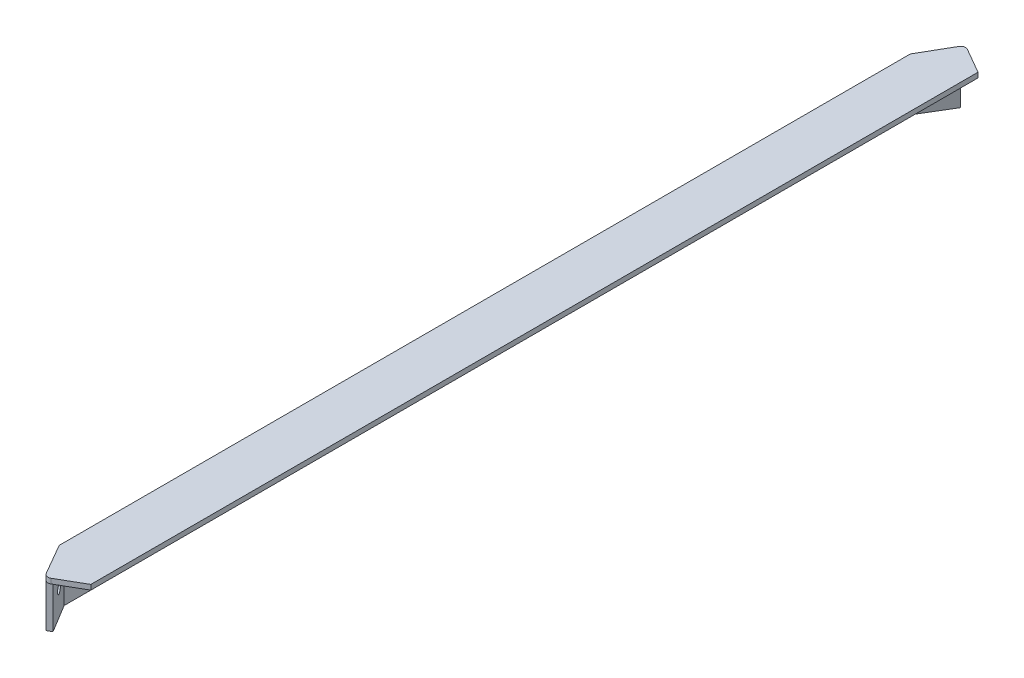
ISO-10303-21;
HEADER;
FILE_DESCRIPTION(('STEP AP214'),'2;1');
FILE_NAME('part.step','',(''),(''),'','','');
FILE_SCHEMA(('AUTOMOTIVE_DESIGN { 1 0 10303 214 1 1 1 1 }'));
ENDSEC;
DATA;
#1=APPLICATION_CONTEXT('core data for automotive mechanical design processes');
#2=APPLICATION_PROTOCOL_DEFINITION('international standard','automotive_design',2000,#1);
#3=PRODUCT_CONTEXT('',#1,'mechanical');
#4=PRODUCT('Part','Part','',(#3));
#5=PRODUCT_RELATED_PRODUCT_CATEGORY('part','',(#4));
#6=PRODUCT_DEFINITION_FORMATION('','',#4);
#7=PRODUCT_DEFINITION_CONTEXT('part definition',#1,'design');
#8=PRODUCT_DEFINITION('design','',#6,#7);
#9=PRODUCT_DEFINITION_SHAPE('','',#8);
#10=(LENGTH_UNIT() NAMED_UNIT(*) SI_UNIT(.MILLI.,.METRE.));
#11=(NAMED_UNIT(*) PLANE_ANGLE_UNIT() SI_UNIT($,.RADIAN.));
#12=(NAMED_UNIT(*) SI_UNIT($,.STERADIAN.) SOLID_ANGLE_UNIT());
#13=UNCERTAINTY_MEASURE_WITH_UNIT(LENGTH_MEASURE(1.E-05),#10,'distance_accuracy_value','');
#14=(GEOMETRIC_REPRESENTATION_CONTEXT(3) GLOBAL_UNCERTAINTY_ASSIGNED_CONTEXT((#13)) GLOBAL_UNIT_ASSIGNED_CONTEXT((#10,
#11,#12)) REPRESENTATION_CONTEXT('',''));
#15=CARTESIAN_POINT('',(0.,0.,0.));
#16=DIRECTION('',(0.,0.,1.));
#17=DIRECTION('',(1.,0.,0.));
#18=AXIS2_PLACEMENT_3D('',#15,#16,#17);
#19=CARTESIAN_POINT('',(7.,0.,600.));
#20=DIRECTION('',(0.,1.,0.));
#21=DIRECTION('',(-1.,0.,0.));
#22=AXIS2_PLACEMENT_3D('',#19,#20,#21);
#23=PLANE('',#22);
#24=DIRECTION('',(0.,0.,-1.));
#25=VECTOR('',#24,1.);
#26=CARTESIAN_POINT('',(0.,0.,600.));
#27=LINE('',#26,#25);
#28=CARTESIAN_POINT('',(0.,0.,600.));
#29=VERTEX_POINT('',#28);
#30=CARTESIAN_POINT('',(0.,0.,-600.));
#31=VERTEX_POINT('',#30);
#32=EDGE_CURVE('E305',#29,#31,#27,.T.);
#33=ORIENTED_EDGE('',*,*,#32,.T.);
#34=DIRECTION('',(0.499999999999995,0.,-0.866025403784441));
#35=VECTOR('',#34,1.);
#36=CARTESIAN_POINT('',(0.,0.,-600.));
#37=LINE('',#36,#35);
#38=CARTESIAN_POINT('',(24.9999999999997,0.,-643.301270189222));
#39=VERTEX_POINT('',#38);
#40=EDGE_CURVE('E165',#31,#39,#37,.T.);
#41=ORIENTED_EDGE('',*,*,#40,.T.);
#42=DIRECTION('',(0.86602540378444,0.,0.499999999999997));
#43=VECTOR('',#42,1.);
#44=CARTESIAN_POINT('',(24.9999999999997,0.,-643.301270189222));
#45=LINE('',#44,#43);
#46=CARTESIAN_POINT('',(31.0621778264906,0.,-639.801270189222));
#47=VERTEX_POINT('',#46);
#48=EDGE_CURVE('E209',#39,#47,#45,.T.);
#49=ORIENTED_EDGE('',*,*,#48,.T.);
#50=DIRECTION('',(-0.517360980401763,0.,0.855767267402608));
#51=VECTOR('',#50,1.);
#52=CARTESIAN_POINT('',(31.0621778264906,0.,-639.801270189222));
#53=LINE('',#52,#51);
#54=CARTESIAN_POINT('',(7.,0.,-600.));
#55=VERTEX_POINT('',#54);
#56=EDGE_CURVE('E205',#47,#55,#53,.T.);
#57=ORIENTED_EDGE('',*,*,#56,.T.);
#58=DIRECTION('',(0.,0.,-1.));
#59=VECTOR('',#58,1.);
#60=CARTESIAN_POINT('',(7.,0.,600.));
#61=LINE('',#60,#59);
#62=CARTESIAN_POINT('',(7.,0.,600.));
#63=VERTEX_POINT('',#62);
#64=EDGE_CURVE('E317',#63,#55,#61,.T.);
#65=ORIENTED_EDGE('',*,*,#64,.F.);
#66=DIRECTION('',(-0.517360980401763,0.,-0.855767267402608));
#67=VECTOR('',#66,1.);
#68=CARTESIAN_POINT('',(31.0621778264906,0.,639.801270189222));
#69=LINE('',#68,#67);
#70=CARTESIAN_POINT('',(31.0621778264906,0.,639.801270189222));
#71=VERTEX_POINT('',#70);
#72=EDGE_CURVE('E283',#71,#63,#69,.T.);
#73=ORIENTED_EDGE('',*,*,#72,.F.);
#74=DIRECTION('',(0.86602540378444,0.,-0.499999999999997));
#75=VECTOR('',#74,1.);
#76=CARTESIAN_POINT('',(24.9999999999997,0.,643.301270189222));
#77=LINE('',#76,#75);
#78=CARTESIAN_POINT('',(24.9999999999997,0.,643.301270189222));
#79=VERTEX_POINT('',#78);
#80=EDGE_CURVE('E286',#79,#71,#77,.T.);
#81=ORIENTED_EDGE('',*,*,#80,.F.);
#82=DIRECTION('',(0.499999999999995,0.,0.866025403784441));
#83=VECTOR('',#82,1.);
#84=CARTESIAN_POINT('',(0.,0.,600.));
#85=LINE('',#84,#83);
#86=EDGE_CURVE('E278',#29,#79,#85,.T.);
#87=ORIENTED_EDGE('',*,*,#86,.F.);
#88=EDGE_LOOP('',(#33,#41,#49,#57,#65,#73,#81,#87));
#89=FACE_BOUND('',#88,.T.);
#90=ADVANCED_FACE('F45',(#89),#23,.F.);
#91=CARTESIAN_POINT('',(6.99999999999999,63.,600.));
#92=DIRECTION('',(-1.,0.,0.));
#93=DIRECTION('',(0.,-1.,0.));
#94=AXIS2_PLACEMENT_3D('',#91,#92,#93);
#95=PLANE('',#94);
#96=ORIENTED_EDGE('',*,*,#64,.T.);
#97=DIRECTION('',(0.,1.,0.));
#98=VECTOR('',#97,1.);
#99=CARTESIAN_POINT('',(6.99999999999999,63.,-600.));
#100=LINE('',#99,#98);
#101=CARTESIAN_POINT('',(6.99999999999999,58.,-600.));
#102=VERTEX_POINT('',#101);
#103=EDGE_CURVE('E221',#55,#102,#100,.T.);
#104=ORIENTED_EDGE('',*,*,#103,.T.);
#105=DIRECTION('',(0.,0.,-1.));
#106=VECTOR('',#105,1.);
#107=CARTESIAN_POINT('',(6.99999999999999,58.,600.));
#108=LINE('',#107,#106);
#109=CARTESIAN_POINT('',(6.99999999999999,58.,600.));
#110=VERTEX_POINT('',#109);
#111=EDGE_CURVE('E55',#102,#110,#108,.F.);
#112=ORIENTED_EDGE('',*,*,#111,.T.);
#113=DIRECTION('',(0.,1.,0.));
#114=VECTOR('',#113,1.);
#115=CARTESIAN_POINT('',(6.99999999999999,63.,600.));
#116=LINE('',#115,#114);
#117=EDGE_CURVE('E299',#63,#110,#116,.T.);
#118=ORIENTED_EDGE('',*,*,#117,.F.);
#119=EDGE_LOOP('',(#96,#104,#112,#118));
#120=FACE_BOUND('',#119,.T.);
#121=ADVANCED_FACE('F355',(#120),#95,.F.);
#122=CARTESIAN_POINT('',(70.,63.,600.));
#123=DIRECTION('',(0.,1.,0.));
#124=DIRECTION('',(-1.,0.,0.));
#125=AXIS2_PLACEMENT_3D('',#122,#123,#124);
#126=PLANE('',#125);
#127=DIRECTION('',(0.86602540378444,0.,-0.499999999999997));
#128=VECTOR('',#127,1.);
#129=CARTESIAN_POINT('',(24.9999999999997,63.,643.301270189222));
#130=LINE('',#129,#128);
#131=CARTESIAN_POINT('',(24.9999999999998,63.,643.301270189222));
#132=VERTEX_POINT('',#131);
#133=CARTESIAN_POINT('',(35.3931854107218,63.,637.300761794604));
#134=VERTEX_POINT('',#133);
#135=EDGE_CURVE('E279',#132,#134,#130,.T.);
#136=ORIENTED_EDGE('',*,*,#135,.T.);
#137=DIRECTION('',(-0.517360980401763,0.,-0.855767267402608));
#138=VECTOR('',#137,1.);
#139=CARTESIAN_POINT('',(11.278836337013,63.,597.413195097991));
#140=LINE('',#139,#138);
#141=CARTESIAN_POINT('',(12.,63.,598.606072567694));
#142=VERTEX_POINT('',#141);
#143=EDGE_CURVE('E323',#134,#142,#140,.T.);
#144=ORIENTED_EDGE('',*,*,#143,.T.);
#145=DIRECTION('',(0.,0.,-1.));
#146=VECTOR('',#145,1.);
#147=CARTESIAN_POINT('',(12.,63.,0.));
#148=LINE('',#147,#146);
#149=CARTESIAN_POINT('',(12.,63.,-598.606072567694));
#150=VERTEX_POINT('',#149);
#151=EDGE_CURVE('E320',#142,#150,#148,.T.);
#152=ORIENTED_EDGE('',*,*,#151,.T.);
#153=DIRECTION('',(-0.517360980401763,0.,0.855767267402608));
#154=VECTOR('',#153,1.);
#155=CARTESIAN_POINT('',(11.278836337013,63.,-597.413195097991));
#156=LINE('',#155,#154);
#157=CARTESIAN_POINT('',(35.3931854107218,63.,-637.300761794604));
#158=VERTEX_POINT('',#157);
#159=EDGE_CURVE('E226',#158,#150,#156,.T.);
#160=ORIENTED_EDGE('',*,*,#159,.F.);
#161=DIRECTION('',(0.86602540378444,0.,0.499999999999997));
#162=VECTOR('',#161,1.);
#163=CARTESIAN_POINT('',(24.9999999999997,63.,-643.301270189222));
#164=LINE('',#163,#162);
#165=CARTESIAN_POINT('',(24.9999999999998,63.,-643.301270189222));
#166=VERTEX_POINT('',#165);
#167=EDGE_CURVE('E200',#166,#158,#164,.T.);
#168=ORIENTED_EDGE('',*,*,#167,.F.);
#169=CARTESIAN_POINT('',(31.0621778264908,63.,-639.801270189222));
#170=DIRECTION('',(0.,-1.,0.));
#171=DIRECTION('',(0.,0.,-1.));
#172=AXIS2_PLACEMENT_3D('',#169,#170,#171);
#173=CIRCLE('',#172,7.00000000000006);
#174=CARTESIAN_POINT('',(34.5621778264908,63.,-645.863448015713));
#175=VERTEX_POINT('',#174);
#176=EDGE_CURVE('E161',#166,#175,#173,.T.);
#177=ORIENTED_EDGE('',*,*,#176,.T.);
#178=DIRECTION('',(0.866025403784437,0.,0.500000000000004));
#179=VECTOR('',#178,1.);
#180=CARTESIAN_POINT('',(34.5621778264909,63.,-645.863448015713));
#181=LINE('',#180,#179);
#182=CARTESIAN_POINT('',(69.9999999999999,63.,-625.403411844343));
#183=VERTEX_POINT('',#182);
#184=EDGE_CURVE('E177',#175,#183,#181,.T.);
#185=ORIENTED_EDGE('',*,*,#184,.T.);
#186=DIRECTION('',(0.,0.,-1.));
#187=VECTOR('',#186,1.);
#188=CARTESIAN_POINT('',(70.,63.,600.));
#189=LINE('',#188,#187);
#190=CARTESIAN_POINT('',(69.9999999999999,63.,625.403411844343));
#191=VERTEX_POINT('',#190);
#192=EDGE_CURVE('E314',#191,#183,#189,.T.);
#193=ORIENTED_EDGE('',*,*,#192,.F.);
#194=DIRECTION('',(0.866025403784437,0.,-0.500000000000004));
#195=VECTOR('',#194,1.);
#196=CARTESIAN_POINT('',(34.5621778264909,63.,645.863448015713));
#197=LINE('',#196,#195);
#198=CARTESIAN_POINT('',(34.5621778264908,63.,645.863448015713));
#199=VERTEX_POINT('',#198);
#200=EDGE_CURVE('E254',#199,#191,#197,.T.);
#201=ORIENTED_EDGE('',*,*,#200,.F.);
#202=CARTESIAN_POINT('',(31.0621778264908,63.,639.801270189222));
#203=DIRECTION('',(0.,1.,0.));
#204=DIRECTION('',(0.,0.,1.));
#205=AXIS2_PLACEMENT_3D('',#202,#203,#204);
#206=CIRCLE('',#205,7.00000000000006);
#207=EDGE_CURVE('E249',#132,#199,#206,.T.);
#208=ORIENTED_EDGE('',*,*,#207,.F.);
#209=EDGE_LOOP('',(#136,#144,#152,#160,#168,#177,#185,#193,#201,#208));
#210=FACE_BOUND('',#209,.T.);
#211=ADVANCED_FACE('F341',(#210),#126,.F.);
#212=CARTESIAN_POINT('',(70.,70.,600.));
#213=DIRECTION('',(-1.,0.,0.));
#214=DIRECTION('',(0.,0.,1.));
#215=AXIS2_PLACEMENT_3D('',#212,#213,#214);
#216=PLANE('',#215);
#217=ORIENTED_EDGE('',*,*,#192,.T.);
#218=DIRECTION('',(0.,-1.,0.));
#219=VECTOR('',#218,1.);
#220=CARTESIAN_POINT('',(69.9999999999999,70.,-625.403411844343));
#221=LINE('',#220,#219);
#222=CARTESIAN_POINT('',(69.9999999999999,70.,-625.403411844343));
#223=VERTEX_POINT('',#222);
#224=EDGE_CURVE('E185',#223,#183,#221,.T.);
#225=ORIENTED_EDGE('',*,*,#224,.F.);
#226=DIRECTION('',(0.,0.,-1.));
#227=VECTOR('',#226,1.);
#228=CARTESIAN_POINT('',(70.,70.,600.));
#229=LINE('',#228,#227);
#230=CARTESIAN_POINT('',(69.9999999999999,70.,625.403411844343));
#231=VERTEX_POINT('',#230);
#232=EDGE_CURVE('E311',#231,#223,#229,.T.);
#233=ORIENTED_EDGE('',*,*,#232,.F.);
#234=DIRECTION('',(0.,-1.,0.));
#235=VECTOR('',#234,1.);
#236=CARTESIAN_POINT('',(69.9999999999999,70.,625.403411844343));
#237=LINE('',#236,#235);
#238=EDGE_CURVE('E261',#231,#191,#237,.T.);
#239=ORIENTED_EDGE('',*,*,#238,.T.);
#240=EDGE_LOOP('',(#217,#225,#233,#239));
#241=FACE_BOUND('',#240,.T.);
#242=ADVANCED_FACE('F387',(#241),#216,.F.);
#243=CARTESIAN_POINT('',(0.,70.,600.));
#244=DIRECTION('',(0.,-1.,0.));
#245=DIRECTION('',(0.,0.,-1.));
#246=AXIS2_PLACEMENT_3D('',#243,#244,#245);
#247=PLANE('',#246);
#248=ORIENTED_EDGE('',*,*,#232,.T.);
#249=DIRECTION('',(0.866025403784437,0.,0.500000000000004));
#250=VECTOR('',#249,1.);
#251=CARTESIAN_POINT('',(34.5621778264909,70.,-645.863448015713));
#252=LINE('',#251,#250);
#253=CARTESIAN_POINT('',(34.5621778264908,70.,-645.863448015713));
#254=VERTEX_POINT('',#253);
#255=EDGE_CURVE('E181',#254,#223,#252,.T.);
#256=ORIENTED_EDGE('',*,*,#255,.F.);
#257=CARTESIAN_POINT('',(31.0621778264908,70.,-639.801270189222));
#258=DIRECTION('',(0.,-1.,0.));
#259=DIRECTION('',(0.,0.,-1.));
#260=AXIS2_PLACEMENT_3D('',#257,#258,#259);
#261=CIRCLE('',#260,7.00000000000006);
#262=CARTESIAN_POINT('',(24.9999999999998,70.,-643.301270189222));
#263=VERTEX_POINT('',#262);
#264=EDGE_CURVE('E158',#263,#254,#261,.T.);
#265=ORIENTED_EDGE('',*,*,#264,.F.);
#266=DIRECTION('',(0.499999999999996,0.,-0.866025403784441));
#267=VECTOR('',#266,1.);
#268=CARTESIAN_POINT('',(0.,70.,-600.));
#269=LINE('',#268,#267);
#270=CARTESIAN_POINT('',(0.,70.,-600.));
#271=VERTEX_POINT('',#270);
#272=EDGE_CURVE('E170',#271,#263,#269,.T.);
#273=ORIENTED_EDGE('',*,*,#272,.F.);
#274=DIRECTION('',(0.,0.,-1.));
#275=VECTOR('',#274,1.);
#276=CARTESIAN_POINT('',(0.,70.,600.));
#277=LINE('',#276,#275);
#278=CARTESIAN_POINT('',(0.,70.,600.));
#279=VERTEX_POINT('',#278);
#280=EDGE_CURVE('E308',#279,#271,#277,.T.);
#281=ORIENTED_EDGE('',*,*,#280,.F.);
#282=DIRECTION('',(0.499999999999996,0.,0.866025403784441));
#283=VECTOR('',#282,1.);
#284=CARTESIAN_POINT('',(0.,70.,600.));
#285=LINE('',#284,#283);
#286=CARTESIAN_POINT('',(24.9999999999998,70.,643.301270189222));
#287=VERTEX_POINT('',#286);
#288=EDGE_CURVE('E250',#279,#287,#285,.T.);
#289=ORIENTED_EDGE('',*,*,#288,.T.);
#290=CARTESIAN_POINT('',(31.0621778264908,70.,639.801270189222));
#291=DIRECTION('',(0.,1.,0.));
#292=DIRECTION('',(0.,0.,1.));
#293=AXIS2_PLACEMENT_3D('',#290,#291,#292);
#294=CIRCLE('',#293,7.00000000000006);
#295=CARTESIAN_POINT('',(34.5621778264908,70.,645.863448015713));
#296=VERTEX_POINT('',#295);
#297=EDGE_CURVE('E253',#287,#296,#294,.T.);
#298=ORIENTED_EDGE('',*,*,#297,.T.);
#299=DIRECTION('',(0.866025403784437,0.,-0.500000000000004));
#300=VECTOR('',#299,1.);
#301=CARTESIAN_POINT('',(34.5621778264909,70.,645.863448015713));
#302=LINE('',#301,#300);
#303=EDGE_CURVE('E257',#296,#231,#302,.T.);
#304=ORIENTED_EDGE('',*,*,#303,.T.);
#305=EDGE_LOOP('',(#248,#256,#265,#273,#281,#289,#298,#304));
#306=FACE_BOUND('',#305,.T.);
#307=ADVANCED_FACE('F179',(#306),#247,.F.);
#308=CARTESIAN_POINT('',(0.,0.,600.));
#309=DIRECTION('',(1.,0.,0.));
#310=DIRECTION('',(0.,0.,-1.));
#311=AXIS2_PLACEMENT_3D('',#308,#309,#310);
#312=PLANE('',#311);
#313=ORIENTED_EDGE('',*,*,#280,.T.);
#314=DIRECTION('',(0.,-1.,0.));
#315=VECTOR('',#314,1.);
#316=CARTESIAN_POINT('',(0.,0.,-600.));
#317=LINE('',#316,#315);
#318=EDGE_CURVE('E174',#271,#31,#317,.T.);
#319=ORIENTED_EDGE('',*,*,#318,.T.);
#320=ORIENTED_EDGE('',*,*,#32,.F.);
#321=DIRECTION('',(0.,-1.,0.));
#322=VECTOR('',#321,1.);
#323=CARTESIAN_POINT('',(0.,0.,600.));
#324=LINE('',#323,#322);
#325=EDGE_CURVE('E302',#279,#29,#324,.T.);
#326=ORIENTED_EDGE('',*,*,#325,.F.);
#327=EDGE_LOOP('',(#313,#319,#320,#326));
#328=FACE_BOUND('',#327,.T.);
#329=ADVANCED_FACE('F369',(#328),#312,.F.);
#330=CARTESIAN_POINT('',(0.,63.,600.));
#331=DIRECTION('',(0.866025403784441,0.,-0.499999999999995));
#332=DIRECTION('',(-0.499999999999995,0.,-0.866025403784441));
#333=AXIS2_PLACEMENT_3D('',#330,#331,#332);
#334=PLANE('',#333);
#335=CARTESIAN_POINT('',(12.5680467926569,35.,621.768495596785));
#336=DIRECTION('',(0.866025403784441,0.,-0.499999999999995));
#337=DIRECTION('',(-0.499999999999995,0.,-0.866025403784441));
#338=AXIS2_PLACEMENT_3D('',#335,#336,#337);
#339=ELLIPSE('',#338,6.00122014708363,5.99999999999997);
#340=CARTESIAN_POINT('',(9.56743671911513,35.,616.571286495708));
#341=VERTEX_POINT('',#340);
#342=EDGE_CURVE('E245',#341,#341,#339,.T.);
#343=ORIENTED_EDGE('',*,*,#342,.T.);
#344=EDGE_LOOP('',(#343));
#345=FACE_BOUND('',#344,.T.);
#346=ORIENTED_EDGE('',*,*,#86,.T.);
#347=DIRECTION('',(0.,-1.,0.));
#348=VECTOR('',#347,1.);
#349=CARTESIAN_POINT('',(24.9999999999997,63.,643.301270189222));
#350=LINE('',#349,#348);
#351=EDGE_CURVE('E295',#132,#79,#350,.T.);
#352=ORIENTED_EDGE('',*,*,#351,.F.);
#353=DIRECTION('',(0.,-1.,0.));
#354=VECTOR('',#353,1.);
#355=CARTESIAN_POINT('',(24.9999999999998,70.,643.301270189222));
#356=LINE('',#355,#354);
#357=EDGE_CURVE('E274',#287,#132,#356,.T.);
#358=ORIENTED_EDGE('',*,*,#357,.F.);
#359=ORIENTED_EDGE('',*,*,#288,.F.);
#360=ORIENTED_EDGE('',*,*,#325,.T.);
#361=EDGE_LOOP('',(#346,#352,#358,#359,#360));
#362=FACE_BOUND('',#361,.T.);
#363=ADVANCED_FACE('F375',(#345,#362),#334,.F.);
#364=CARTESIAN_POINT('',(24.9999999999997,63.,643.301270189222));
#365=DIRECTION('',(-0.499999999999997,0.,-0.86602540378444));
#366=DIRECTION('',(-0.86602540378444,0.,0.499999999999997));
#367=AXIS2_PLACEMENT_3D('',#364,#365,#366);
#368=PLANE('',#367);
#369=ORIENTED_EDGE('',*,*,#80,.T.);
#370=DIRECTION('',(0.,-1.,0.));
#371=VECTOR('',#370,1.);
#372=CARTESIAN_POINT('',(31.0621778264906,63.,639.801270189222));
#373=LINE('',#372,#371);
#374=CARTESIAN_POINT('',(31.0621778264906,58.,639.801270189222));
#375=VERTEX_POINT('',#374);
#376=EDGE_CURVE('E282',#375,#71,#373,.T.);
#377=ORIENTED_EDGE('',*,*,#376,.F.);
#378=CARTESIAN_POINT('',(35.3931854107218,58.,637.300761794604));
#379=DIRECTION('',(-0.499999999999997,0.,-0.86602540378444));
#380=DIRECTION('',(0.86602540378444,0.,-0.499999999999997));
#381=AXIS2_PLACEMENT_3D('',#378,#379,#380);
#382=ELLIPSE('',#381,5.00101678923638,5.);
#383=EDGE_CURVE('E11',#375,#134,#382,.T.);
#384=ORIENTED_EDGE('',*,*,#383,.T.);
#385=ORIENTED_EDGE('',*,*,#135,.F.);
#386=ORIENTED_EDGE('',*,*,#351,.T.);
#387=EDGE_LOOP('',(#369,#377,#384,#385,#386));
#388=FACE_BOUND('',#387,.T.);
#389=ADVANCED_FACE('F346',(#388),#368,.F.);
#390=CARTESIAN_POINT('',(31.0621778264906,63.,639.801270189222));
#391=DIRECTION('',(-0.855767267402608,0.,0.517360980401763));
#392=DIRECTION('',(0.517360980401763,0.,0.855767267402608));
#393=AXIS2_PLACEMENT_3D('',#390,#391,#392);
#394=PLANE('',#393);
#395=CARTESIAN_POINT('',(18.1281533164464,35.,618.407088504157));
#396=DIRECTION('',(0.855767267402608,0.,-0.517360980401763));
#397=DIRECTION('',(-0.517360980401763,0.,-0.855767267402608));
#398=AXIS2_PLACEMENT_3D('',#395,#396,#397);
#399=CIRCLE('',#398,5.99999999999997);
#400=CARTESIAN_POINT('',(15.0239874340358,35.,613.272484899741));
#401=VERTEX_POINT('',#400);
#402=EDGE_CURVE('E241',#401,#401,#399,.T.);
#403=ORIENTED_EDGE('',*,*,#402,.F.);
#404=EDGE_LOOP('',(#403));
#405=FACE_BOUND('',#404,.T.);
#406=ORIENTED_EDGE('',*,*,#117,.T.);
#407=DIRECTION('',(-0.517360980401763,0.,-0.855767267402608));
#408=VECTOR('',#407,1.);
#409=CARTESIAN_POINT('',(31.0621778264906,58.,639.801270189222));
#410=LINE('',#409,#408);
#411=EDGE_CURVE('E62',#110,#375,#410,.F.);
#412=ORIENTED_EDGE('',*,*,#411,.T.);
#413=ORIENTED_EDGE('',*,*,#376,.T.);
#414=ORIENTED_EDGE('',*,*,#72,.T.);
#415=EDGE_LOOP('',(#406,#412,#413,#414));
#416=FACE_BOUND('',#415,.T.);
#417=ADVANCED_FACE('F349',(#405,#416),#394,.F.);
#418=CARTESIAN_POINT('',(31.0621778264908,70.,639.801270189222));
#419=DIRECTION('',(0.,-1.,0.));
#420=DIRECTION('',(0.,0.,-1.));
#421=AXIS2_PLACEMENT_3D('',#418,#419,#420);
#422=CYLINDRICAL_SURFACE('',#421,7.00000000000006);
#423=ORIENTED_EDGE('',*,*,#207,.T.);
#424=DIRECTION('',(0.,-1.,0.));
#425=VECTOR('',#424,1.);
#426=CARTESIAN_POINT('',(34.5621778264908,70.,645.863448015713));
#427=LINE('',#426,#425);
#428=EDGE_CURVE('E270',#296,#199,#427,.T.);
#429=ORIENTED_EDGE('',*,*,#428,.F.);
#430=ORIENTED_EDGE('',*,*,#297,.F.);
#431=ORIENTED_EDGE('',*,*,#357,.T.);
#432=EDGE_LOOP('',(#423,#429,#430,#431));
#433=FACE_BOUND('',#432,.T.);
#434=ADVANCED_FACE('F377',(#433),#422,.T.);
#435=CARTESIAN_POINT('',(34.5621778264909,70.,645.863448015713));
#436=DIRECTION('',(-0.500000000000003,0.,-0.866025403784437));
#437=DIRECTION('',(-0.866025403784437,0.,0.500000000000004));
#438=AXIS2_PLACEMENT_3D('',#435,#436,#437);
#439=PLANE('',#438);
#440=ORIENTED_EDGE('',*,*,#200,.T.);
#441=ORIENTED_EDGE('',*,*,#238,.F.);
#442=ORIENTED_EDGE('',*,*,#303,.F.);
#443=ORIENTED_EDGE('',*,*,#428,.T.);
#444=EDGE_LOOP('',(#440,#441,#442,#443));
#445=FACE_BOUND('',#444,.T.);
#446=ADVANCED_FACE('F381',(#445),#439,.F.);
#447=CARTESIAN_POINT('',(12.1377824446281,35.,622.028615366969));
#448=DIRECTION('',(0.855767267402608,0.,-0.517360980401763));
#449=DIRECTION('',(-0.517360980401763,0.,-0.855767267402608));
#450=AXIS2_PLACEMENT_3D('',#447,#448,#449);
#451=CYLINDRICAL_SURFACE('',#450,5.99999999999997);
#452=ORIENTED_EDGE('',*,*,#402,.T.);
#453=EDGE_LOOP('',(#452));
#454=FACE_BOUND('',#453,.T.);
#455=ORIENTED_EDGE('',*,*,#342,.F.);
#456=EDGE_LOOP('',(#455));
#457=FACE_BOUND('',#456,.T.);
#458=ADVANCED_FACE('F412',(#454,#457),#451,.F.);
#459=CARTESIAN_POINT('',(12.,58.,600.));
#460=DIRECTION('',(0.,0.,1.));
#461=DIRECTION('',(1.,0.,0.));
#462=AXIS2_PLACEMENT_3D('',#459,#460,#461);
#463=CYLINDRICAL_SURFACE('',#462,5.);
#464=ORIENTED_EDGE('',*,*,#111,.F.);
#465=CARTESIAN_POINT('',(12.,58.,-598.606072567694));
#466=DIRECTION('',(-0.268544905553422,0.,0.963267166315402));
#467=DIRECTION('',(0.963267166315402,0.,0.268544905553422));
#468=AXIS2_PLACEMENT_3D('',#465,#466,#467);
#469=ELLIPSE('',#468,5.19066794223406,5.);
#470=EDGE_CURVE('E236',#102,#150,#469,.F.);
#471=ORIENTED_EDGE('',*,*,#470,.T.);
#472=ORIENTED_EDGE('',*,*,#151,.F.);
#473=CARTESIAN_POINT('',(12.,58.,598.606072567694));
#474=DIRECTION('',(0.268544905553422,0.,0.963267166315402));
#475=DIRECTION('',(0.963267166315402,0.,-0.268544905553422));
#476=AXIS2_PLACEMENT_3D('',#473,#474,#475);
#477=ELLIPSE('',#476,5.19066794223406,5.);
#478=EDGE_CURVE('E49',#110,#142,#477,.F.);
#479=ORIENTED_EDGE('',*,*,#478,.F.);
#480=EDGE_LOOP('',(#464,#471,#472,#479));
#481=FACE_BOUND('',#480,.T.);
#482=ADVANCED_FACE('F47',(#481),#463,.F.);
#483=CARTESIAN_POINT('',(28.1415665316763,58.,625.305852422918));
#484=DIRECTION('',(0.517360980401763,0.,0.855767267402608));
#485=DIRECTION('',(0.855767267402608,0.,-0.517360980401763));
#486=AXIS2_PLACEMENT_3D('',#483,#484,#485);
#487=CYLINDRICAL_SURFACE('',#486,5.);
#488=ORIENTED_EDGE('',*,*,#383,.F.);
#489=ORIENTED_EDGE('',*,*,#411,.F.);
#490=ORIENTED_EDGE('',*,*,#478,.T.);
#491=ORIENTED_EDGE('',*,*,#143,.F.);
#492=EDGE_LOOP('',(#488,#489,#490,#491));
#493=FACE_BOUND('',#492,.T.);
#494=ADVANCED_FACE('F336',(#493),#487,.F.);
#495=CARTESIAN_POINT('',(0.,63.,-600.));
#496=DIRECTION('',(0.866025403784441,0.,0.499999999999995));
#497=DIRECTION('',(-0.499999999999995,0.,0.866025403784441));
#498=AXIS2_PLACEMENT_3D('',#495,#496,#497);
#499=PLANE('',#498);
#500=CARTESIAN_POINT('',(12.5680467926569,35.,-621.768495596785));
#501=DIRECTION('',(-0.866025403784441,0.,-0.499999999999995));
#502=DIRECTION('',(-0.499999999999995,0.,0.866025403784441));
#503=AXIS2_PLACEMENT_3D('',#500,#501,#502);
#504=ELLIPSE('',#503,6.00122014708363,5.99999999999997);
#505=CARTESIAN_POINT('',(9.56743671911513,35.,-616.571286495708));
#506=VERTEX_POINT('',#505);
#507=EDGE_CURVE('E191',#506,#506,#504,.T.);
#508=ORIENTED_EDGE('',*,*,#507,.F.);
#509=EDGE_LOOP('',(#508));
#510=FACE_BOUND('',#509,.T.);
#511=ORIENTED_EDGE('',*,*,#40,.F.);
#512=ORIENTED_EDGE('',*,*,#318,.F.);
#513=ORIENTED_EDGE('',*,*,#272,.T.);
#514=DIRECTION('',(0.,-1.,0.));
#515=VECTOR('',#514,1.);
#516=CARTESIAN_POINT('',(24.9999999999998,70.,-643.301270189222));
#517=LINE('',#516,#515);
#518=EDGE_CURVE('E154',#263,#166,#517,.T.);
#519=ORIENTED_EDGE('',*,*,#518,.T.);
#520=DIRECTION('',(0.,-1.,0.));
#521=VECTOR('',#520,1.);
#522=CARTESIAN_POINT('',(24.9999999999997,63.,-643.301270189222));
#523=LINE('',#522,#521);
#524=EDGE_CURVE('E218',#166,#39,#523,.T.);
#525=ORIENTED_EDGE('',*,*,#524,.T.);
#526=EDGE_LOOP('',(#511,#512,#513,#519,#525));
#527=FACE_BOUND('',#526,.T.);
#528=ADVANCED_FACE('F172',(#510,#527),#499,.F.);
#529=CARTESIAN_POINT('',(24.9999999999997,63.,-643.301270189222));
#530=DIRECTION('',(-0.499999999999997,0.,0.86602540378444));
#531=DIRECTION('',(-0.86602540378444,0.,-0.499999999999997));
#532=AXIS2_PLACEMENT_3D('',#529,#530,#531);
#533=PLANE('',#532);
#534=ORIENTED_EDGE('',*,*,#48,.F.);
#535=ORIENTED_EDGE('',*,*,#524,.F.);
#536=ORIENTED_EDGE('',*,*,#167,.T.);
#537=CARTESIAN_POINT('',(35.3931854107218,58.,-637.300761794604));
#538=DIRECTION('',(0.499999999999997,0.,-0.86602540378444));
#539=DIRECTION('',(0.86602540378444,0.,0.499999999999997));
#540=AXIS2_PLACEMENT_3D('',#537,#538,#539);
#541=ELLIPSE('',#540,5.00101678923638,5.);
#542=CARTESIAN_POINT('',(31.0621778264906,58.,-639.801270189222));
#543=VERTEX_POINT('',#542);
#544=EDGE_CURVE('E233',#543,#158,#541,.T.);
#545=ORIENTED_EDGE('',*,*,#544,.F.);
#546=DIRECTION('',(0.,-1.,0.));
#547=VECTOR('',#546,1.);
#548=CARTESIAN_POINT('',(31.0621778264906,63.,-639.801270189222));
#549=LINE('',#548,#547);
#550=EDGE_CURVE('E204',#543,#47,#549,.T.);
#551=ORIENTED_EDGE('',*,*,#550,.T.);
#552=EDGE_LOOP('',(#534,#535,#536,#545,#551));
#553=FACE_BOUND('',#552,.T.);
#554=ADVANCED_FACE('F365',(#553),#533,.F.);
#555=CARTESIAN_POINT('',(31.0621778264906,63.,-639.801270189222));
#556=DIRECTION('',(-0.855767267402608,0.,-0.517360980401763));
#557=DIRECTION('',(0.517360980401763,0.,-0.855767267402608));
#558=AXIS2_PLACEMENT_3D('',#555,#556,#557);
#559=PLANE('',#558);
#560=CARTESIAN_POINT('',(18.1281533164464,35.,-618.407088504157));
#561=DIRECTION('',(-0.855767267402608,0.,-0.517360980401763));
#562=DIRECTION('',(-0.517360980401763,0.,0.855767267402608));
#563=AXIS2_PLACEMENT_3D('',#560,#561,#562);
#564=CIRCLE('',#563,5.99999999999997);
#565=CARTESIAN_POINT('',(15.0239874340358,35.,-613.272484899741));
#566=VERTEX_POINT('',#565);
#567=EDGE_CURVE('E240',#566,#566,#564,.T.);
#568=ORIENTED_EDGE('',*,*,#567,.T.);
#569=EDGE_LOOP('',(#568));
#570=FACE_BOUND('',#569,.T.);
#571=ORIENTED_EDGE('',*,*,#103,.F.);
#572=ORIENTED_EDGE('',*,*,#56,.F.);
#573=ORIENTED_EDGE('',*,*,#550,.F.);
#574=DIRECTION('',(-0.517360980401763,0.,0.855767267402608));
#575=VECTOR('',#574,1.);
#576=CARTESIAN_POINT('',(31.0621778264906,58.,-639.801270189222));
#577=LINE('',#576,#575);
#578=EDGE_CURVE('E230',#102,#543,#577,.F.);
#579=ORIENTED_EDGE('',*,*,#578,.F.);
#580=EDGE_LOOP('',(#571,#572,#573,#579));
#581=FACE_BOUND('',#580,.T.);
#582=ADVANCED_FACE('F358',(#570,#581),#559,.F.);
#583=CARTESIAN_POINT('',(31.0621778264908,70.,-639.801270189222));
#584=DIRECTION('',(0.,-1.,0.));
#585=DIRECTION('',(0.,0.,1.));
#586=AXIS2_PLACEMENT_3D('',#583,#584,#585);
#587=CYLINDRICAL_SURFACE('',#586,7.00000000000006);
#588=ORIENTED_EDGE('',*,*,#176,.F.);
#589=ORIENTED_EDGE('',*,*,#518,.F.);
#590=ORIENTED_EDGE('',*,*,#264,.T.);
#591=DIRECTION('',(0.,-1.,0.));
#592=VECTOR('',#591,1.);
#593=CARTESIAN_POINT('',(34.5621778264908,70.,-645.863448015713));
#594=LINE('',#593,#592);
#595=EDGE_CURVE('E166',#254,#175,#594,.T.);
#596=ORIENTED_EDGE('',*,*,#595,.T.);
#597=EDGE_LOOP('',(#588,#589,#590,#596));
#598=FACE_BOUND('',#597,.T.);
#599=ADVANCED_FACE('F156',(#598),#587,.T.);
#600=CARTESIAN_POINT('',(34.5621778264909,70.,-645.863448015713));
#601=DIRECTION('',(-0.500000000000003,0.,0.866025403784437));
#602=DIRECTION('',(-0.866025403784437,0.,-0.500000000000004));
#603=AXIS2_PLACEMENT_3D('',#600,#601,#602);
#604=PLANE('',#603);
#605=ORIENTED_EDGE('',*,*,#184,.F.);
#606=ORIENTED_EDGE('',*,*,#595,.F.);
#607=ORIENTED_EDGE('',*,*,#255,.T.);
#608=ORIENTED_EDGE('',*,*,#224,.T.);
#609=EDGE_LOOP('',(#605,#606,#607,#608));
#610=FACE_BOUND('',#609,.T.);
#611=ADVANCED_FACE('F386',(#610),#604,.F.);
#612=CARTESIAN_POINT('',(12.1377824446281,35.,-622.028615366969));
#613=DIRECTION('',(0.855767267402608,0.,0.517360980401763));
#614=DIRECTION('',(-0.517360980401763,0.,0.855767267402608));
#615=AXIS2_PLACEMENT_3D('',#612,#613,#614);
#616=CYLINDRICAL_SURFACE('',#615,5.99999999999997);
#617=ORIENTED_EDGE('',*,*,#567,.F.);
#618=EDGE_LOOP('',(#617));
#619=FACE_BOUND('',#618,.T.);
#620=ORIENTED_EDGE('',*,*,#507,.T.);
#621=EDGE_LOOP('',(#620));
#622=FACE_BOUND('',#621,.T.);
#623=ADVANCED_FACE('F591',(#619,#622),#616,.F.);
#624=CARTESIAN_POINT('',(28.1415665316763,58.,-625.305852422918));
#625=DIRECTION('',(0.517360980401763,0.,-0.855767267402608));
#626=DIRECTION('',(0.855767267402608,0.,0.517360980401763));
#627=AXIS2_PLACEMENT_3D('',#624,#625,#626);
#628=CYLINDRICAL_SURFACE('',#627,5.);
#629=ORIENTED_EDGE('',*,*,#544,.T.);
#630=ORIENTED_EDGE('',*,*,#159,.T.);
#631=ORIENTED_EDGE('',*,*,#470,.F.);
#632=ORIENTED_EDGE('',*,*,#578,.T.);
#633=EDGE_LOOP('',(#629,#630,#631,#632));
#634=FACE_BOUND('',#633,.T.);
#635=ADVANCED_FACE('F362',(#634),#628,.F.);
#636=CLOSED_SHELL('',(#90,#121,#211,#242,#307,#329,#363,#389,#417,#434,#446,#458,#482,#494,#528,
#554,#582,#599,#611,#623,#635));
#637=MANIFOLD_SOLID_BREP('B2',#636);
#638=ADVANCED_BREP_SHAPE_REPRESENTATION('',(#18,#637),#14);
#639=SHAPE_DEFINITION_REPRESENTATION(#9,#638);
ENDSEC;
END-ISO-10303-21;
